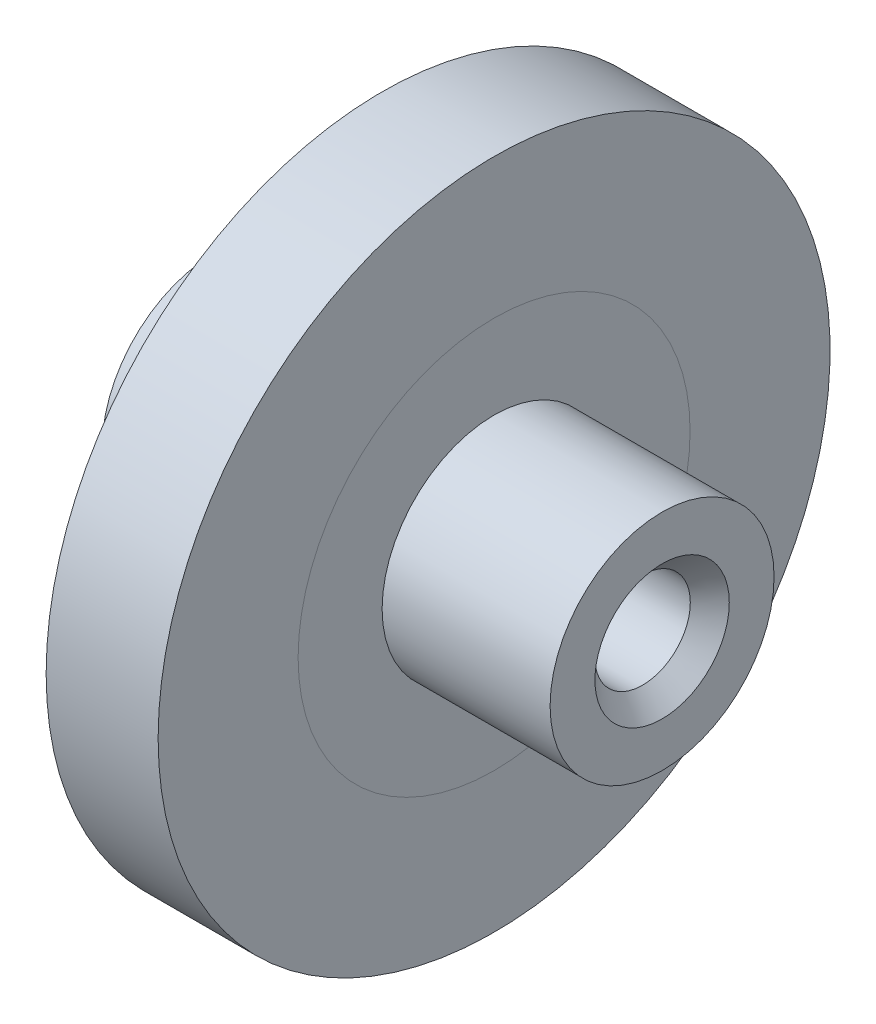
ISO-10303-21;
HEADER;
FILE_DESCRIPTION(('STEP AP214'),'2;1');
FILE_NAME('part.step','',(''),(''),'','','');
FILE_SCHEMA(('AUTOMOTIVE_DESIGN { 1 0 10303 214 1 1 1 1 }'));
ENDSEC;
DATA;
#1=APPLICATION_CONTEXT('core data for automotive mechanical design processes');
#2=APPLICATION_PROTOCOL_DEFINITION('international standard','automotive_design',2000,#1);
#3=PRODUCT_CONTEXT('',#1,'mechanical');
#4=PRODUCT('Part','Part','',(#3));
#5=PRODUCT_RELATED_PRODUCT_CATEGORY('part','',(#4));
#6=PRODUCT_DEFINITION_FORMATION('','',#4);
#7=PRODUCT_DEFINITION_CONTEXT('part definition',#1,'design');
#8=PRODUCT_DEFINITION('design','',#6,#7);
#9=PRODUCT_DEFINITION_SHAPE('','',#8);
#10=(LENGTH_UNIT() NAMED_UNIT(*) SI_UNIT(.MILLI.,.METRE.));
#11=(NAMED_UNIT(*) PLANE_ANGLE_UNIT() SI_UNIT($,.RADIAN.));
#12=(NAMED_UNIT(*) SI_UNIT($,.STERADIAN.) SOLID_ANGLE_UNIT());
#13=UNCERTAINTY_MEASURE_WITH_UNIT(LENGTH_MEASURE(1.E-05),#10,'distance_accuracy_value','');
#14=(GEOMETRIC_REPRESENTATION_CONTEXT(3) GLOBAL_UNCERTAINTY_ASSIGNED_CONTEXT((#13)) GLOBAL_UNIT_ASSIGNED_CONTEXT((#10,
#11,#12)) REPRESENTATION_CONTEXT('',''));
#15=CARTESIAN_POINT('',(0.,0.,0.));
#16=DIRECTION('',(0.,0.,1.));
#17=DIRECTION('',(1.,0.,0.));
#18=AXIS2_PLACEMENT_3D('',#15,#16,#17);
#19=CARTESIAN_POINT('',(3.175,0.,0.));
#20=DIRECTION('',(1.,0.,0.));
#21=DIRECTION('',(0.,0.,-1.));
#22=AXIS2_PLACEMENT_3D('',#19,#20,#21);
#23=PLANE('',#22);
#24=CARTESIAN_POINT('',(3.175,0.,0.));
#25=DIRECTION('',(-1.,0.,0.));
#26=DIRECTION('',(0.,0.,1.));
#27=AXIS2_PLACEMENT_3D('',#24,#25,#26);
#28=CIRCLE('',#27,19.05);
#29=CARTESIAN_POINT('',(3.175,0.,19.05));
#30=VERTEX_POINT('',#29);
#31=EDGE_CURVE('E63',#30,#30,#28,.T.);
#32=ORIENTED_EDGE('',*,*,#31,.F.);
#33=EDGE_LOOP('',(#32));
#34=FACE_BOUND('',#33,.T.);
#35=CARTESIAN_POINT('',(3.175,0.,0.));
#36=DIRECTION('',(1.,0.,0.));
#37=DIRECTION('',(0.,0.,-1.));
#38=AXIS2_PLACEMENT_3D('',#35,#36,#37);
#39=CIRCLE('',#38,11.1125);
#40=CARTESIAN_POINT('',(3.175,0.,-11.1125));
#41=VERTEX_POINT('',#40);
#42=EDGE_CURVE('E10',#41,#41,#39,.F.);
#43=ORIENTED_EDGE('',*,*,#42,.T.);
#44=EDGE_LOOP('',(#43));
#45=FACE_BOUND('',#44,.T.);
#46=ADVANCED_FACE('F45',(#34,#45),#23,.T.);
#47=CARTESIAN_POINT('',(12.7,0.,0.));
#48=DIRECTION('',(1.,0.,0.));
#49=DIRECTION('',(0.,0.,-1.));
#50=AXIS2_PLACEMENT_3D('',#47,#48,#49);
#51=PLANE('',#50);
#52=CARTESIAN_POINT('',(12.7,0.,0.));
#53=DIRECTION('',(1.,0.,0.));
#54=DIRECTION('',(0.,0.,-1.));
#55=AXIS2_PLACEMENT_3D('',#52,#53,#54);
#56=CIRCLE('',#55,3.81);
#57=CARTESIAN_POINT('',(12.7,0.,-3.81));
#58=VERTEX_POINT('',#57);
#59=EDGE_CURVE('E83',#58,#58,#56,.T.);
#60=ORIENTED_EDGE('',*,*,#59,.F.);
#61=EDGE_LOOP('',(#60));
#62=FACE_BOUND('',#61,.T.);
#63=CARTESIAN_POINT('',(12.7,0.,0.));
#64=DIRECTION('',(-1.,0.,0.));
#65=DIRECTION('',(0.,0.,1.));
#66=AXIS2_PLACEMENT_3D('',#63,#64,#65);
#67=CIRCLE('',#66,6.35);
#68=CARTESIAN_POINT('',(12.7,0.,6.35));
#69=VERTEX_POINT('',#68);
#70=EDGE_CURVE('E53',#69,#69,#67,.T.);
#71=ORIENTED_EDGE('',*,*,#70,.F.);
#72=EDGE_LOOP('',(#71));
#73=FACE_BOUND('',#72,.T.);
#74=ADVANCED_FACE('F47',(#62,#73),#51,.T.);
#75=CARTESIAN_POINT('',(0.,0.,0.));
#76=DIRECTION('',(-1.,0.,0.));
#77=DIRECTION('',(0.,0.,1.));
#78=AXIS2_PLACEMENT_3D('',#75,#76,#77);
#79=CYLINDRICAL_SURFACE('',#78,6.35);
#80=ORIENTED_EDGE('',*,*,#70,.T.);
#81=EDGE_LOOP('',(#80));
#82=FACE_BOUND('',#81,.T.);
#83=CARTESIAN_POINT('',(3.175,0.,0.));
#84=DIRECTION('',(-1.,0.,0.));
#85=DIRECTION('',(0.,0.,1.));
#86=AXIS2_PLACEMENT_3D('',#83,#84,#85);
#87=CIRCLE('',#86,6.35);
#88=CARTESIAN_POINT('',(3.175,0.,6.35));
#89=VERTEX_POINT('',#88);
#90=EDGE_CURVE('E59',#89,#89,#87,.T.);
#91=ORIENTED_EDGE('',*,*,#90,.F.);
#92=EDGE_LOOP('',(#91));
#93=FACE_BOUND('',#92,.T.);
#94=ADVANCED_FACE('F114',(#82,#93),#79,.T.);
#95=ORIENTED_EDGE('',*,*,#42,.F.);
#96=EDGE_LOOP('',(#95));
#97=FACE_BOUND('',#96,.T.);
#98=ORIENTED_EDGE('',*,*,#90,.T.);
#99=EDGE_LOOP('',(#98));
#100=FACE_BOUND('',#99,.T.);
#101=ADVANCED_FACE('F119',(#97,#100),#23,.T.);
#102=CARTESIAN_POINT('',(0.,0.,0.));
#103=DIRECTION('',(-1.,0.,0.));
#104=DIRECTION('',(0.,0.,1.));
#105=AXIS2_PLACEMENT_3D('',#102,#103,#104);
#106=CYLINDRICAL_SURFACE('',#105,19.05);
#107=ORIENTED_EDGE('',*,*,#31,.T.);
#108=EDGE_LOOP('',(#107));
#109=FACE_BOUND('',#108,.T.);
#110=CARTESIAN_POINT('',(-3.175,0.,0.));
#111=DIRECTION('',(-1.,0.,0.));
#112=DIRECTION('',(0.,0.,1.));
#113=AXIS2_PLACEMENT_3D('',#110,#111,#112);
#114=CIRCLE('',#113,19.05);
#115=CARTESIAN_POINT('',(-3.175,0.,19.05));
#116=VERTEX_POINT('',#115);
#117=EDGE_CURVE('E74',#116,#116,#114,.T.);
#118=ORIENTED_EDGE('',*,*,#117,.F.);
#119=EDGE_LOOP('',(#118));
#120=FACE_BOUND('',#119,.T.);
#121=ADVANCED_FACE('F127',(#109,#120),#106,.T.);
#122=CARTESIAN_POINT('',(-12.7,0.,0.));
#123=DIRECTION('',(-1.,0.,0.));
#124=DIRECTION('',(0.,0.,-1.));
#125=AXIS2_PLACEMENT_3D('',#122,#123,#124);
#126=PLANE('',#125);
#127=CARTESIAN_POINT('',(-12.7,0.,0.));
#128=DIRECTION('',(1.,0.,0.));
#129=DIRECTION('',(0.,0.,-1.));
#130=AXIS2_PLACEMENT_3D('',#127,#128,#129);
#131=CIRCLE('',#130,3.34009999999999);
#132=CARTESIAN_POINT('',(-12.7,0.,-3.34009999999999));
#133=VERTEX_POINT('',#132);
#134=EDGE_CURVE('E86',#133,#133,#131,.T.);
#135=ORIENTED_EDGE('',*,*,#134,.T.);
#136=EDGE_LOOP('',(#135));
#137=FACE_BOUND('',#136,.T.);
#138=CARTESIAN_POINT('',(-12.7,0.,0.));
#139=DIRECTION('',(-1.,0.,0.));
#140=DIRECTION('',(0.,0.,1.));
#141=AXIS2_PLACEMENT_3D('',#138,#139,#140);
#142=CIRCLE('',#141,6.35);
#143=CARTESIAN_POINT('',(-12.7,0.,6.35));
#144=VERTEX_POINT('',#143);
#145=EDGE_CURVE('E68',#144,#144,#142,.T.);
#146=ORIENTED_EDGE('',*,*,#145,.T.);
#147=EDGE_LOOP('',(#146));
#148=FACE_BOUND('',#147,.T.);
#149=ADVANCED_FACE('F90',(#137,#148),#126,.T.);
#150=CARTESIAN_POINT('',(0.,0.,0.));
#151=DIRECTION('',(1.,0.,0.));
#152=DIRECTION('',(0.,0.,1.));
#153=AXIS2_PLACEMENT_3D('',#150,#151,#152);
#154=CYLINDRICAL_SURFACE('',#153,6.35);
#155=ORIENTED_EDGE('',*,*,#145,.F.);
#156=EDGE_LOOP('',(#155));
#157=FACE_BOUND('',#156,.T.);
#158=CARTESIAN_POINT('',(-3.175,0.,0.));
#159=DIRECTION('',(-1.,0.,0.));
#160=DIRECTION('',(0.,0.,1.));
#161=AXIS2_PLACEMENT_3D('',#158,#159,#160);
#162=CIRCLE('',#161,6.35);
#163=CARTESIAN_POINT('',(-3.175,0.,6.35));
#164=VERTEX_POINT('',#163);
#165=EDGE_CURVE('E71',#164,#164,#162,.T.);
#166=ORIENTED_EDGE('',*,*,#165,.T.);
#167=EDGE_LOOP('',(#166));
#168=FACE_BOUND('',#167,.T.);
#169=ADVANCED_FACE('F139',(#157,#168),#154,.T.);
#170=CARTESIAN_POINT('',(-3.175,0.,0.));
#171=DIRECTION('',(-1.,0.,0.));
#172=DIRECTION('',(0.,0.,-1.));
#173=AXIS2_PLACEMENT_3D('',#170,#171,#172);
#174=PLANE('',#173);
#175=ORIENTED_EDGE('',*,*,#165,.F.);
#176=EDGE_LOOP('',(#175));
#177=FACE_BOUND('',#176,.T.);
#178=ORIENTED_EDGE('',*,*,#117,.T.);
#179=EDGE_LOOP('',(#178));
#180=FACE_BOUND('',#179,.T.);
#181=ADVANCED_FACE('F97',(#177,#180),#174,.T.);
#182=CARTESIAN_POINT('',(-12.065,0.,0.));
#183=DIRECTION('',(-1.,0.,0.));
#184=DIRECTION('',(0.,0.,1.));
#185=AXIS2_PLACEMENT_3D('',#182,#183,#184);
#186=CONICAL_SURFACE('',#185,2.7051,0.785398163397447);
#187=ORIENTED_EDGE('',*,*,#134,.F.);
#188=EDGE_LOOP('',(#187));
#189=FACE_BOUND('',#188,.T.);
#190=CARTESIAN_POINT('',(-12.065,0.,0.));
#191=DIRECTION('',(1.,0.,0.));
#192=DIRECTION('',(0.,0.,-1.));
#193=AXIS2_PLACEMENT_3D('',#190,#191,#192);
#194=CIRCLE('',#193,2.7051);
#195=CARTESIAN_POINT('',(-12.065,0.,-2.7051));
#196=VERTEX_POINT('',#195);
#197=EDGE_CURVE('E77',#196,#196,#194,.T.);
#198=ORIENTED_EDGE('',*,*,#197,.T.);
#199=EDGE_LOOP('',(#198));
#200=FACE_BOUND('',#199,.T.);
#201=ADVANCED_FACE('F93',(#189,#200),#186,.F.);
#202=CARTESIAN_POINT('',(12.7,0.,0.));
#203=DIRECTION('',(1.,0.,0.));
#204=DIRECTION('',(0.,0.,-1.));
#205=AXIS2_PLACEMENT_3D('',#202,#203,#204);
#206=CYLINDRICAL_SURFACE('',#205,2.7051);
#207=ORIENTED_EDGE('',*,*,#197,.F.);
#208=EDGE_LOOP('',(#207));
#209=FACE_BOUND('',#208,.T.);
#210=CARTESIAN_POINT('',(11.5951,0.,0.));
#211=DIRECTION('',(1.,0.,0.));
#212=DIRECTION('',(0.,0.,-1.));
#213=AXIS2_PLACEMENT_3D('',#210,#211,#212);
#214=CIRCLE('',#213,2.7051);
#215=CARTESIAN_POINT('',(11.5951,0.,-2.7051));
#216=VERTEX_POINT('',#215);
#217=EDGE_CURVE('E80',#216,#216,#214,.T.);
#218=ORIENTED_EDGE('',*,*,#217,.T.);
#219=EDGE_LOOP('',(#218));
#220=FACE_BOUND('',#219,.T.);
#221=ADVANCED_FACE('F96',(#209,#220),#206,.F.);
#222=CARTESIAN_POINT('',(12.7,0.,0.));
#223=DIRECTION('',(1.,0.,0.));
#224=DIRECTION('',(0.,0.,-1.));
#225=AXIS2_PLACEMENT_3D('',#222,#223,#224);
#226=CONICAL_SURFACE('',#225,3.81,0.785398163397447);
#227=ORIENTED_EDGE('',*,*,#217,.F.);
#228=EDGE_LOOP('',(#227));
#229=FACE_BOUND('',#228,.T.);
#230=ORIENTED_EDGE('',*,*,#59,.T.);
#231=EDGE_LOOP('',(#230));
#232=FACE_BOUND('',#231,.T.);
#233=ADVANCED_FACE('F103',(#229,#232),#226,.F.);
#234=CLOSED_SHELL('',(#46,#74,#94,#101,#121,#149,#169,#181,#201,#221,#233));
#235=MANIFOLD_SOLID_BREP('B2',#234);
#236=ADVANCED_BREP_SHAPE_REPRESENTATION('',(#18,#235),#14);
#237=SHAPE_DEFINITION_REPRESENTATION(#9,#236);
ENDSEC;
END-ISO-10303-21;
